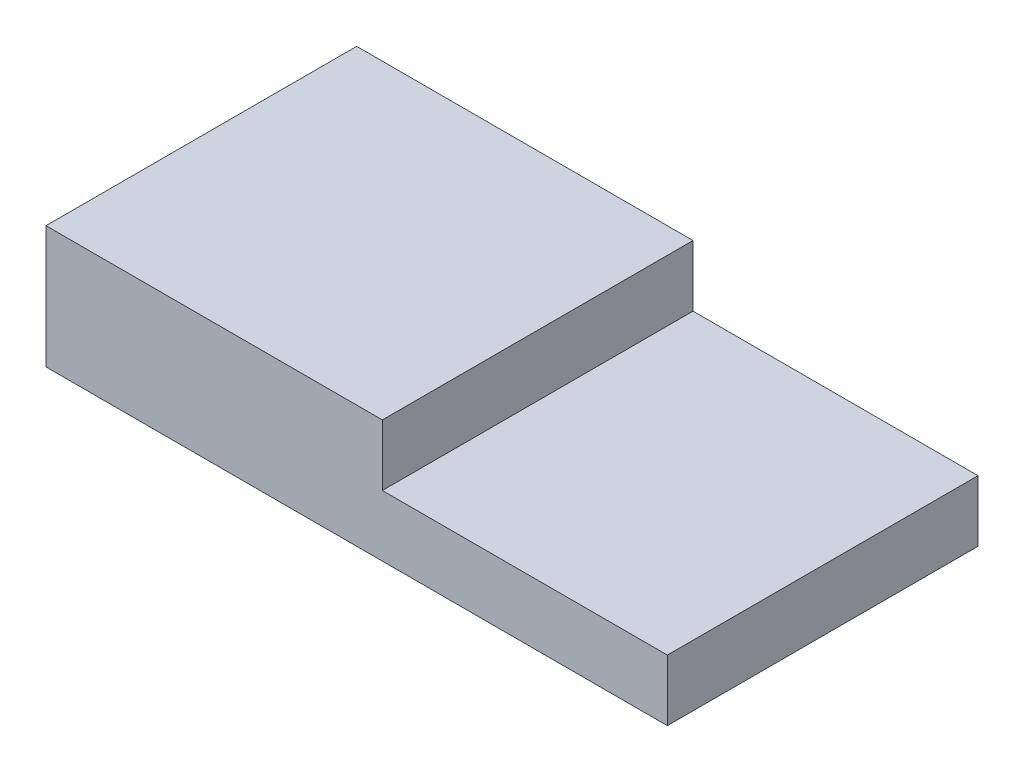
ISO-10303-21;
HEADER;
FILE_DESCRIPTION(('STEP AP214'),'2;1');
FILE_NAME('part.step','',(''),(''),'','','');
FILE_SCHEMA(('AUTOMOTIVE_DESIGN { 1 0 10303 214 1 1 1 1 }'));
ENDSEC;
DATA;
#1=APPLICATION_CONTEXT('core data for automotive mechanical design processes');
#2=APPLICATION_PROTOCOL_DEFINITION('international standard','automotive_design',2000,#1);
#3=PRODUCT_CONTEXT('',#1,'mechanical');
#4=PRODUCT('Part','Part','',(#3));
#5=PRODUCT_RELATED_PRODUCT_CATEGORY('part','',(#4));
#6=PRODUCT_DEFINITION_FORMATION('','',#4);
#7=PRODUCT_DEFINITION_CONTEXT('part definition',#1,'design');
#8=PRODUCT_DEFINITION('design','',#6,#7);
#9=PRODUCT_DEFINITION_SHAPE('','',#8);
#10=(LENGTH_UNIT() NAMED_UNIT(*) SI_UNIT(.MILLI.,.METRE.));
#11=(NAMED_UNIT(*) PLANE_ANGLE_UNIT() SI_UNIT($,.RADIAN.));
#12=(NAMED_UNIT(*) SI_UNIT($,.STERADIAN.) SOLID_ANGLE_UNIT());
#13=UNCERTAINTY_MEASURE_WITH_UNIT(LENGTH_MEASURE(1.E-05),#10,'distance_accuracy_value','');
#14=(GEOMETRIC_REPRESENTATION_CONTEXT(3) GLOBAL_UNCERTAINTY_ASSIGNED_CONTEXT((#13)) GLOBAL_UNIT_ASSIGNED_CONTEXT((#10,
#11,#12)) REPRESENTATION_CONTEXT('',''));
#15=CARTESIAN_POINT('',(0.,0.,0.));
#16=DIRECTION('',(0.,0.,1.));
#17=DIRECTION('',(1.,0.,0.));
#18=AXIS2_PLACEMENT_3D('',#15,#16,#17);
#19=CARTESIAN_POINT('',(0.,10.,0.));
#20=DIRECTION('',(0.,-1.,0.));
#21=DIRECTION('',(0.,0.,-1.));
#22=AXIS2_PLACEMENT_3D('',#19,#20,#21);
#23=PLANE('',#22);
#24=DIRECTION('',(0.,0.,-1.));
#25=VECTOR('',#24,1.);
#26=CARTESIAN_POINT('',(4.2,10.,25.4));
#27=LINE('',#26,#25);
#28=CARTESIAN_POINT('',(4.2,10.,25.4));
#29=VERTEX_POINT('',#28);
#30=CARTESIAN_POINT('',(4.2,10.,-25.4));
#31=VERTEX_POINT('',#30);
#32=EDGE_CURVE('E50',#29,#31,#27,.T.);
#33=ORIENTED_EDGE('',*,*,#32,.F.);
#34=DIRECTION('',(1.,0.,0.));
#35=VECTOR('',#34,1.);
#36=CARTESIAN_POINT('',(-50.8,10.,25.4));
#37=LINE('',#36,#35);
#38=CARTESIAN_POINT('',(50.8,10.,25.4));
#39=VERTEX_POINT('',#38);
#40=EDGE_CURVE('E87',#29,#39,#37,.T.);
#41=ORIENTED_EDGE('',*,*,#40,.T.);
#42=DIRECTION('',(0.,0.,-1.));
#43=VECTOR('',#42,1.);
#44=CARTESIAN_POINT('',(50.8,10.,25.4));
#45=LINE('',#44,#43);
#46=CARTESIAN_POINT('',(50.8,10.,-25.4));
#47=VERTEX_POINT('',#46);
#48=EDGE_CURVE('E56',#39,#47,#45,.T.);
#49=ORIENTED_EDGE('',*,*,#48,.T.);
#50=DIRECTION('',(-1.,0.,0.));
#51=VECTOR('',#50,1.);
#52=CARTESIAN_POINT('',(-50.8,10.,-25.4));
#53=LINE('',#52,#51);
#54=EDGE_CURVE('E97',#47,#31,#53,.T.);
#55=ORIENTED_EDGE('',*,*,#54,.T.);
#56=EDGE_LOOP('',(#33,#41,#49,#55));
#57=FACE_BOUND('',#56,.T.);
#58=ADVANCED_FACE('F35',(#57),#23,.F.);
#59=CARTESIAN_POINT('',(-50.8,10.,25.4));
#60=DIRECTION('',(1.,0.,0.));
#61=DIRECTION('',(0.,0.,-1.));
#62=AXIS2_PLACEMENT_3D('',#59,#60,#61);
#63=PLANE('',#62);
#64=DIRECTION('',(0.,0.,1.));
#65=VECTOR('',#64,1.);
#66=CARTESIAN_POINT('',(-50.8,0.,25.4));
#67=LINE('',#66,#65);
#68=CARTESIAN_POINT('',(-50.8,0.,-25.4));
#69=VERTEX_POINT('',#68);
#70=CARTESIAN_POINT('',(-50.8,0.,25.4));
#71=VERTEX_POINT('',#70);
#72=EDGE_CURVE('E94',#69,#71,#67,.T.);
#73=ORIENTED_EDGE('',*,*,#72,.T.);
#74=DIRECTION('',(0.,-1.,0.));
#75=VECTOR('',#74,1.);
#76=CARTESIAN_POINT('',(-50.8,10.,25.4));
#77=LINE('',#76,#75);
#78=CARTESIAN_POINT('',(-50.8,20.,25.4));
#79=VERTEX_POINT('',#78);
#80=EDGE_CURVE('E11',#79,#71,#77,.T.);
#81=ORIENTED_EDGE('',*,*,#80,.F.);
#82=DIRECTION('',(0.,0.,1.));
#83=VECTOR('',#82,1.);
#84=CARTESIAN_POINT('',(-50.8,20.,25.4));
#85=LINE('',#84,#83);
#86=CARTESIAN_POINT('',(-50.8,20.,-25.4));
#87=VERTEX_POINT('',#86);
#88=EDGE_CURVE('E96',#87,#79,#85,.T.);
#89=ORIENTED_EDGE('',*,*,#88,.F.);
#90=DIRECTION('',(0.,-1.,0.));
#91=VECTOR('',#90,1.);
#92=CARTESIAN_POINT('',(-50.8,10.,-25.4));
#93=LINE('',#92,#91);
#94=EDGE_CURVE('E80',#87,#69,#93,.T.);
#95=ORIENTED_EDGE('',*,*,#94,.T.);
#96=EDGE_LOOP('',(#73,#81,#89,#95));
#97=FACE_BOUND('',#96,.T.);
#98=ADVANCED_FACE('F37',(#97),#63,.F.);
#99=CARTESIAN_POINT('',(-50.8,10.,25.4));
#100=DIRECTION('',(0.,0.,-1.));
#101=DIRECTION('',(-1.,0.,0.));
#102=AXIS2_PLACEMENT_3D('',#99,#100,#101);
#103=PLANE('',#102);
#104=DIRECTION('',(1.,0.,0.));
#105=VECTOR('',#104,1.);
#106=CARTESIAN_POINT('',(-50.8,0.,25.4));
#107=LINE('',#106,#105);
#108=CARTESIAN_POINT('',(50.8,0.,25.4));
#109=VERTEX_POINT('',#108);
#110=EDGE_CURVE('E100',#71,#109,#107,.T.);
#111=ORIENTED_EDGE('',*,*,#110,.T.);
#112=DIRECTION('',(0.,-1.,0.));
#113=VECTOR('',#112,1.);
#114=CARTESIAN_POINT('',(50.8,10.,25.4));
#115=LINE('',#114,#113);
#116=EDGE_CURVE('E43',#39,#109,#115,.T.);
#117=ORIENTED_EDGE('',*,*,#116,.F.);
#118=ORIENTED_EDGE('',*,*,#40,.F.);
#119=DIRECTION('',(0.,-1.,0.));
#120=VECTOR('',#119,1.);
#121=CARTESIAN_POINT('',(4.2,20.,25.4));
#122=LINE('',#121,#120);
#123=CARTESIAN_POINT('',(4.2,20.,25.4));
#124=VERTEX_POINT('',#123);
#125=EDGE_CURVE('E101',#124,#29,#122,.T.);
#126=ORIENTED_EDGE('',*,*,#125,.F.);
#127=DIRECTION('',(1.,0.,0.));
#128=VECTOR('',#127,1.);
#129=CARTESIAN_POINT('',(-50.8,20.,25.4));
#130=LINE('',#129,#128);
#131=EDGE_CURVE('E121',#79,#124,#130,.T.);
#132=ORIENTED_EDGE('',*,*,#131,.F.);
#133=ORIENTED_EDGE('',*,*,#80,.T.);
#134=EDGE_LOOP('',(#111,#117,#118,#126,#132,#133));
#135=FACE_BOUND('',#134,.T.);
#136=ADVANCED_FACE('F116',(#135),#103,.F.);
#137=CARTESIAN_POINT('',(50.8,10.,25.4));
#138=DIRECTION('',(-1.,0.,0.));
#139=DIRECTION('',(0.,0.,1.));
#140=AXIS2_PLACEMENT_3D('',#137,#138,#139);
#141=PLANE('',#140);
#142=DIRECTION('',(0.,0.,-1.));
#143=VECTOR('',#142,1.);
#144=CARTESIAN_POINT('',(50.8,0.,25.4));
#145=LINE('',#144,#143);
#146=CARTESIAN_POINT('',(50.8,0.,-25.4));
#147=VERTEX_POINT('',#146);
#148=EDGE_CURVE('E88',#109,#147,#145,.T.);
#149=ORIENTED_EDGE('',*,*,#148,.T.);
#150=DIRECTION('',(0.,-1.,0.));
#151=VECTOR('',#150,1.);
#152=CARTESIAN_POINT('',(50.8,10.,-25.4));
#153=LINE('',#152,#151);
#154=EDGE_CURVE('E83',#47,#147,#153,.T.);
#155=ORIENTED_EDGE('',*,*,#154,.F.);
#156=ORIENTED_EDGE('',*,*,#48,.F.);
#157=ORIENTED_EDGE('',*,*,#116,.T.);
#158=EDGE_LOOP('',(#149,#155,#156,#157));
#159=FACE_BOUND('',#158,.T.);
#160=ADVANCED_FACE('F114',(#159),#141,.F.);
#161=CARTESIAN_POINT('',(-50.8,10.,-25.4));
#162=DIRECTION('',(0.,0.,1.));
#163=DIRECTION('',(1.,0.,0.));
#164=AXIS2_PLACEMENT_3D('',#161,#162,#163);
#165=PLANE('',#164);
#166=DIRECTION('',(-1.,0.,0.));
#167=VECTOR('',#166,1.);
#168=CARTESIAN_POINT('',(-50.8,0.,-25.4));
#169=LINE('',#168,#167);
#170=EDGE_CURVE('E76',#147,#69,#169,.T.);
#171=ORIENTED_EDGE('',*,*,#170,.T.);
#172=ORIENTED_EDGE('',*,*,#94,.F.);
#173=DIRECTION('',(-1.,0.,0.));
#174=VECTOR('',#173,1.);
#175=CARTESIAN_POINT('',(-50.8,20.,-25.4));
#176=LINE('',#175,#174);
#177=CARTESIAN_POINT('',(4.2,20.,-25.4));
#178=VERTEX_POINT('',#177);
#179=EDGE_CURVE('E135',#178,#87,#176,.T.);
#180=ORIENTED_EDGE('',*,*,#179,.F.);
#181=DIRECTION('',(0.,-1.,0.));
#182=VECTOR('',#181,1.);
#183=CARTESIAN_POINT('',(4.2,20.,-25.4));
#184=LINE('',#183,#182);
#185=EDGE_CURVE('E105',#178,#31,#184,.T.);
#186=ORIENTED_EDGE('',*,*,#185,.T.);
#187=ORIENTED_EDGE('',*,*,#54,.F.);
#188=ORIENTED_EDGE('',*,*,#154,.T.);
#189=EDGE_LOOP('',(#171,#172,#180,#186,#187,#188));
#190=FACE_BOUND('',#189,.T.);
#191=ADVANCED_FACE('F78',(#190),#165,.F.);
#192=CARTESIAN_POINT('',(0.,0.,0.));
#193=DIRECTION('',(0.,-1.,0.));
#194=DIRECTION('',(0.,0.,-1.));
#195=AXIS2_PLACEMENT_3D('',#192,#193,#194);
#196=PLANE('',#195);
#197=ORIENTED_EDGE('',*,*,#72,.F.);
#198=ORIENTED_EDGE('',*,*,#170,.F.);
#199=ORIENTED_EDGE('',*,*,#148,.F.);
#200=ORIENTED_EDGE('',*,*,#110,.F.);
#201=EDGE_LOOP('',(#197,#198,#199,#200));
#202=FACE_BOUND('',#201,.T.);
#203=ADVANCED_FACE('F99',(#202),#196,.T.);
#204=CARTESIAN_POINT('',(4.2,20.,25.4));
#205=DIRECTION('',(-1.,0.,0.));
#206=DIRECTION('',(0.,0.,1.));
#207=AXIS2_PLACEMENT_3D('',#204,#205,#206);
#208=PLANE('',#207);
#209=ORIENTED_EDGE('',*,*,#32,.T.);
#210=ORIENTED_EDGE('',*,*,#185,.F.);
#211=DIRECTION('',(0.,0.,-1.));
#212=VECTOR('',#211,1.);
#213=CARTESIAN_POINT('',(4.2,20.,25.4));
#214=LINE('',#213,#212);
#215=EDGE_CURVE('E132',#124,#178,#214,.T.);
#216=ORIENTED_EDGE('',*,*,#215,.F.);
#217=ORIENTED_EDGE('',*,*,#125,.T.);
#218=EDGE_LOOP('',(#209,#210,#216,#217));
#219=FACE_BOUND('',#218,.T.);
#220=ADVANCED_FACE('F139',(#219),#208,.F.);
#221=CARTESIAN_POINT('',(0.,20.,0.));
#222=DIRECTION('',(0.,-1.,0.));
#223=DIRECTION('',(0.,0.,-1.));
#224=AXIS2_PLACEMENT_3D('',#221,#222,#223);
#225=PLANE('',#224);
#226=ORIENTED_EDGE('',*,*,#88,.T.);
#227=ORIENTED_EDGE('',*,*,#131,.T.);
#228=ORIENTED_EDGE('',*,*,#215,.T.);
#229=ORIENTED_EDGE('',*,*,#179,.T.);
#230=EDGE_LOOP('',(#226,#227,#228,#229));
#231=FACE_BOUND('',#230,.T.);
#232=ADVANCED_FACE('F134',(#231),#225,.F.);
#233=CLOSED_SHELL('',(#58,#98,#136,#160,#191,#203,#220,#232));
#234=MANIFOLD_SOLID_BREP('B2',#233);
#235=ADVANCED_BREP_SHAPE_REPRESENTATION('',(#18,#234),#14);
#236=SHAPE_DEFINITION_REPRESENTATION(#9,#235);
ENDSEC;
END-ISO-10303-21;
